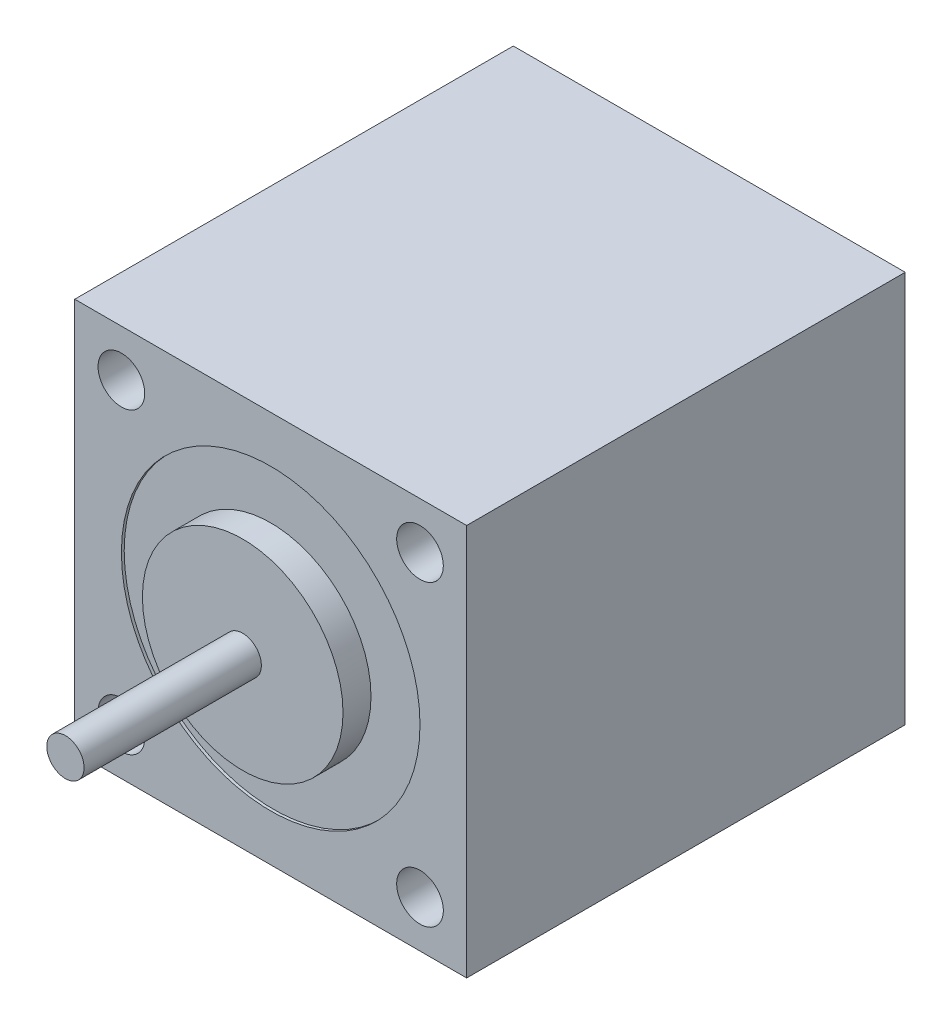
ISO-10303-21;
HEADER;
FILE_DESCRIPTION(('STEP AP214'),'2;1');
FILE_NAME('part.step','',(''),(''),'','','');
FILE_SCHEMA(('AUTOMOTIVE_DESIGN { 1 0 10303 214 1 1 1 1 }'));
ENDSEC;
DATA;
#1=APPLICATION_CONTEXT('core data for automotive mechanical design processes');
#2=APPLICATION_PROTOCOL_DEFINITION('international standard','automotive_design',2000,#1);
#3=PRODUCT_CONTEXT('',#1,'mechanical');
#4=PRODUCT('Part','Part','',(#3));
#5=PRODUCT_RELATED_PRODUCT_CATEGORY('part','',(#4));
#6=PRODUCT_DEFINITION_FORMATION('','',#4);
#7=PRODUCT_DEFINITION_CONTEXT('part definition',#1,'design');
#8=PRODUCT_DEFINITION('design','',#6,#7);
#9=PRODUCT_DEFINITION_SHAPE('','',#8);
#10=(LENGTH_UNIT() NAMED_UNIT(*) SI_UNIT(.MILLI.,.METRE.));
#11=(NAMED_UNIT(*) PLANE_ANGLE_UNIT() SI_UNIT($,.RADIAN.));
#12=(NAMED_UNIT(*) SI_UNIT($,.STERADIAN.) SOLID_ANGLE_UNIT());
#13=UNCERTAINTY_MEASURE_WITH_UNIT(LENGTH_MEASURE(1.E-05),#10,'distance_accuracy_value','');
#14=(GEOMETRIC_REPRESENTATION_CONTEXT(3) GLOBAL_UNCERTAINTY_ASSIGNED_CONTEXT((#13)) GLOBAL_UNIT_ASSIGNED_CONTEXT((#10,
#11,#12)) REPRESENTATION_CONTEXT('',''));
#15=CARTESIAN_POINT('',(0.,0.,0.));
#16=DIRECTION('',(0.,0.,1.));
#17=DIRECTION('',(1.,0.,0.));
#18=AXIS2_PLACEMENT_3D('',#15,#16,#17);
#19=CARTESIAN_POINT('',(21.,-21.,47.));
#20=DIRECTION('',(-1.,0.,0.));
#21=DIRECTION('',(0.,0.,1.));
#22=AXIS2_PLACEMENT_3D('',#19,#20,#21);
#23=PLANE('',#22);
#24=DIRECTION('',(0.,1.,0.));
#25=VECTOR('',#24,1.);
#26=CARTESIAN_POINT('',(21.,-21.,0.));
#27=LINE('',#26,#25);
#28=CARTESIAN_POINT('',(21.,-21.,0.));
#29=VERTEX_POINT('',#28);
#30=CARTESIAN_POINT('',(21.,21.,0.));
#31=VERTEX_POINT('',#30);
#32=EDGE_CURVE('E122',#29,#31,#27,.T.);
#33=ORIENTED_EDGE('',*,*,#32,.T.);
#34=DIRECTION('',(0.,0.,-1.));
#35=VECTOR('',#34,1.);
#36=CARTESIAN_POINT('',(21.,21.,47.));
#37=LINE('',#36,#35);
#38=CARTESIAN_POINT('',(21.,21.,47.));
#39=VERTEX_POINT('',#38);
#40=EDGE_CURVE('E105',#39,#31,#37,.T.);
#41=ORIENTED_EDGE('',*,*,#40,.F.);
#42=DIRECTION('',(0.,1.,0.));
#43=VECTOR('',#42,1.);
#44=CARTESIAN_POINT('',(21.,-21.,47.));
#45=LINE('',#44,#43);
#46=CARTESIAN_POINT('',(21.,-21.,47.));
#47=VERTEX_POINT('',#46);
#48=EDGE_CURVE('E133',#47,#39,#45,.T.);
#49=ORIENTED_EDGE('',*,*,#48,.F.);
#50=DIRECTION('',(0.,0.,-1.));
#51=VECTOR('',#50,1.);
#52=CARTESIAN_POINT('',(21.,-21.,47.));
#53=LINE('',#52,#51);
#54=EDGE_CURVE('E108',#47,#29,#53,.T.);
#55=ORIENTED_EDGE('',*,*,#54,.T.);
#56=EDGE_LOOP('',(#33,#41,#49,#55));
#57=FACE_BOUND('',#56,.T.);
#58=ADVANCED_FACE('F50',(#57),#23,.F.);
#59=CARTESIAN_POINT('',(-21.,21.,47.));
#60=DIRECTION('',(0.,-1.,0.));
#61=DIRECTION('',(0.,0.,-1.));
#62=AXIS2_PLACEMENT_3D('',#59,#60,#61);
#63=PLANE('',#62);
#64=DIRECTION('',(-1.,0.,0.));
#65=VECTOR('',#64,1.);
#66=CARTESIAN_POINT('',(-21.,21.,0.));
#67=LINE('',#66,#65);
#68=CARTESIAN_POINT('',(-21.,21.,0.));
#69=VERTEX_POINT('',#68);
#70=EDGE_CURVE('E68',#31,#69,#67,.T.);
#71=ORIENTED_EDGE('',*,*,#70,.T.);
#72=DIRECTION('',(0.,0.,-1.));
#73=VECTOR('',#72,1.);
#74=CARTESIAN_POINT('',(-21.,21.,47.));
#75=LINE('',#74,#73);
#76=CARTESIAN_POINT('',(-21.,21.,47.));
#77=VERTEX_POINT('',#76);
#78=EDGE_CURVE('E102',#77,#69,#75,.T.);
#79=ORIENTED_EDGE('',*,*,#78,.F.);
#80=DIRECTION('',(-1.,0.,0.));
#81=VECTOR('',#80,1.);
#82=CARTESIAN_POINT('',(-21.,21.,47.));
#83=LINE('',#82,#81);
#84=EDGE_CURVE('E84',#39,#77,#83,.T.);
#85=ORIENTED_EDGE('',*,*,#84,.F.);
#86=ORIENTED_EDGE('',*,*,#40,.T.);
#87=EDGE_LOOP('',(#71,#79,#85,#86));
#88=FACE_BOUND('',#87,.T.);
#89=ADVANCED_FACE('F101',(#88),#63,.F.);
#90=CARTESIAN_POINT('',(-21.,-21.,47.));
#91=DIRECTION('',(1.,0.,0.));
#92=DIRECTION('',(0.,0.,-1.));
#93=AXIS2_PLACEMENT_3D('',#90,#91,#92);
#94=PLANE('',#93);
#95=DIRECTION('',(0.,-1.,0.));
#96=VECTOR('',#95,1.);
#97=CARTESIAN_POINT('',(-21.,-21.,0.));
#98=LINE('',#97,#96);
#99=CARTESIAN_POINT('',(-21.,-21.,0.));
#100=VERTEX_POINT('',#99);
#101=EDGE_CURVE('E99',#69,#100,#98,.T.);
#102=ORIENTED_EDGE('',*,*,#101,.T.);
#103=DIRECTION('',(0.,0.,-1.));
#104=VECTOR('',#103,1.);
#105=CARTESIAN_POINT('',(-21.,-21.,47.));
#106=LINE('',#105,#104);
#107=CARTESIAN_POINT('',(-21.,-21.,47.));
#108=VERTEX_POINT('',#107);
#109=EDGE_CURVE('E136',#108,#100,#106,.T.);
#110=ORIENTED_EDGE('',*,*,#109,.F.);
#111=DIRECTION('',(0.,-1.,0.));
#112=VECTOR('',#111,1.);
#113=CARTESIAN_POINT('',(-21.,-21.,47.));
#114=LINE('',#113,#112);
#115=EDGE_CURVE('E111',#77,#108,#114,.T.);
#116=ORIENTED_EDGE('',*,*,#115,.F.);
#117=ORIENTED_EDGE('',*,*,#78,.T.);
#118=EDGE_LOOP('',(#102,#110,#116,#117));
#119=FACE_BOUND('',#118,.T.);
#120=ADVANCED_FACE('F110',(#119),#94,.F.);
#121=CARTESIAN_POINT('',(-21.,-21.,47.));
#122=DIRECTION('',(0.,1.,0.));
#123=DIRECTION('',(0.,0.,1.));
#124=AXIS2_PLACEMENT_3D('',#121,#122,#123);
#125=PLANE('',#124);
#126=DIRECTION('',(1.,0.,0.));
#127=VECTOR('',#126,1.);
#128=CARTESIAN_POINT('',(-21.,-21.,0.));
#129=LINE('',#128,#127);
#130=EDGE_CURVE('E93',#100,#29,#129,.T.);
#131=ORIENTED_EDGE('',*,*,#130,.T.);
#132=ORIENTED_EDGE('',*,*,#54,.F.);
#133=DIRECTION('',(1.,0.,0.));
#134=VECTOR('',#133,1.);
#135=CARTESIAN_POINT('',(-21.,-21.,47.));
#136=LINE('',#135,#134);
#137=EDGE_CURVE('E125',#108,#47,#136,.T.);
#138=ORIENTED_EDGE('',*,*,#137,.F.);
#139=ORIENTED_EDGE('',*,*,#109,.T.);
#140=EDGE_LOOP('',(#131,#132,#138,#139));
#141=FACE_BOUND('',#140,.T.);
#142=ADVANCED_FACE('F176',(#141),#125,.F.);
#143=CARTESIAN_POINT('',(0.,0.,47.));
#144=DIRECTION('',(0.,0.,-1.));
#145=DIRECTION('',(-1.,0.,0.));
#146=AXIS2_PLACEMENT_3D('',#143,#144,#145);
#147=PLANE('',#146);
#148=CARTESIAN_POINT('',(0.,0.,47.));
#149=DIRECTION('',(0.,0.,1.));
#150=DIRECTION('',(1.,0.,0.));
#151=AXIS2_PLACEMENT_3D('',#148,#149,#150);
#152=CIRCLE('',#151,16.);
#153=CARTESIAN_POINT('',(16.,0.,47.));
#154=VERTEX_POINT('',#153);
#155=EDGE_CURVE('E60',#154,#154,#152,.T.);
#156=ORIENTED_EDGE('',*,*,#155,.F.);
#157=EDGE_LOOP('',(#156));
#158=FACE_BOUND('',#157,.T.);
#159=CARTESIAN_POINT('',(-16.,-16.,47.));
#160=DIRECTION('',(0.,0.,1.));
#161=DIRECTION('',(1.,0.,0.));
#162=AXIS2_PLACEMENT_3D('',#159,#160,#161);
#163=CIRCLE('',#162,2.5);
#164=CARTESIAN_POINT('',(-13.5,-16.,47.));
#165=VERTEX_POINT('',#164);
#166=EDGE_CURVE('E151',#165,#165,#163,.T.);
#167=ORIENTED_EDGE('',*,*,#166,.F.);
#168=EDGE_LOOP('',(#167));
#169=FACE_BOUND('',#168,.T.);
#170=CARTESIAN_POINT('',(16.,-16.,47.));
#171=DIRECTION('',(0.,0.,1.));
#172=DIRECTION('',(-1.,0.,0.));
#173=AXIS2_PLACEMENT_3D('',#170,#171,#172);
#174=CIRCLE('',#173,2.5);
#175=CARTESIAN_POINT('',(13.5,-16.,47.));
#176=VERTEX_POINT('',#175);
#177=EDGE_CURVE('E155',#176,#176,#174,.T.);
#178=ORIENTED_EDGE('',*,*,#177,.F.);
#179=EDGE_LOOP('',(#178));
#180=FACE_BOUND('',#179,.T.);
#181=CARTESIAN_POINT('',(16.,16.,47.));
#182=DIRECTION('',(0.,0.,1.));
#183=DIRECTION('',(1.,0.,0.));
#184=AXIS2_PLACEMENT_3D('',#181,#182,#183);
#185=CIRCLE('',#184,2.5);
#186=CARTESIAN_POINT('',(18.5,16.,47.));
#187=VERTEX_POINT('',#186);
#188=EDGE_CURVE('E141',#187,#187,#185,.T.);
#189=ORIENTED_EDGE('',*,*,#188,.F.);
#190=EDGE_LOOP('',(#189));
#191=FACE_BOUND('',#190,.T.);
#192=CARTESIAN_POINT('',(-16.,16.,47.));
#193=DIRECTION('',(0.,0.,1.));
#194=DIRECTION('',(-1.,0.,0.));
#195=AXIS2_PLACEMENT_3D('',#192,#193,#194);
#196=CIRCLE('',#195,2.5);
#197=CARTESIAN_POINT('',(-18.5,16.,47.));
#198=VERTEX_POINT('',#197);
#199=EDGE_CURVE('E137',#198,#198,#196,.T.);
#200=ORIENTED_EDGE('',*,*,#199,.F.);
#201=EDGE_LOOP('',(#200));
#202=FACE_BOUND('',#201,.T.);
#203=ORIENTED_EDGE('',*,*,#48,.T.);
#204=ORIENTED_EDGE('',*,*,#84,.T.);
#205=ORIENTED_EDGE('',*,*,#115,.T.);
#206=ORIENTED_EDGE('',*,*,#137,.T.);
#207=EDGE_LOOP('',(#203,#204,#205,#206));
#208=FACE_BOUND('',#207,.T.);
#209=ADVANCED_FACE('F173',(#158,#169,#180,#191,#202,#208),#147,.F.);
#210=CARTESIAN_POINT('',(0.,0.,0.));
#211=DIRECTION('',(0.,0.,-1.));
#212=DIRECTION('',(-1.,0.,0.));
#213=AXIS2_PLACEMENT_3D('',#210,#211,#212);
#214=PLANE('',#213);
#215=CARTESIAN_POINT('',(-16.,-16.,0.));
#216=DIRECTION('',(0.,0.,1.));
#217=DIRECTION('',(1.,0.,0.));
#218=AXIS2_PLACEMENT_3D('',#215,#216,#217);
#219=CIRCLE('',#218,2.5);
#220=CARTESIAN_POINT('',(-13.5,-16.,0.));
#221=VERTEX_POINT('',#220);
#222=EDGE_CURVE('E128',#221,#221,#219,.T.);
#223=ORIENTED_EDGE('',*,*,#222,.T.);
#224=EDGE_LOOP('',(#223));
#225=FACE_BOUND('',#224,.T.);
#226=CARTESIAN_POINT('',(16.,-16.,0.));
#227=DIRECTION('',(0.,0.,1.));
#228=DIRECTION('',(-1.,0.,0.));
#229=AXIS2_PLACEMENT_3D('',#226,#227,#228);
#230=CIRCLE('',#229,2.5);
#231=CARTESIAN_POINT('',(13.5,-16.,0.));
#232=VERTEX_POINT('',#231);
#233=EDGE_CURVE('E150',#232,#232,#230,.T.);
#234=ORIENTED_EDGE('',*,*,#233,.T.);
#235=EDGE_LOOP('',(#234));
#236=FACE_BOUND('',#235,.T.);
#237=CARTESIAN_POINT('',(16.,16.,0.));
#238=DIRECTION('',(0.,0.,1.));
#239=DIRECTION('',(1.,0.,0.));
#240=AXIS2_PLACEMENT_3D('',#237,#238,#239);
#241=CIRCLE('',#240,2.5);
#242=CARTESIAN_POINT('',(18.5,16.,0.));
#243=VERTEX_POINT('',#242);
#244=EDGE_CURVE('E146',#243,#243,#241,.T.);
#245=ORIENTED_EDGE('',*,*,#244,.T.);
#246=EDGE_LOOP('',(#245));
#247=FACE_BOUND('',#246,.T.);
#248=CARTESIAN_POINT('',(-16.,16.,0.));
#249=DIRECTION('',(0.,0.,1.));
#250=DIRECTION('',(-1.,0.,0.));
#251=AXIS2_PLACEMENT_3D('',#248,#249,#250);
#252=CIRCLE('',#251,2.5);
#253=CARTESIAN_POINT('',(-18.5,16.,0.));
#254=VERTEX_POINT('',#253);
#255=EDGE_CURVE('E142',#254,#254,#252,.T.);
#256=ORIENTED_EDGE('',*,*,#255,.T.);
#257=EDGE_LOOP('',(#256));
#258=FACE_BOUND('',#257,.T.);
#259=ORIENTED_EDGE('',*,*,#32,.F.);
#260=ORIENTED_EDGE('',*,*,#130,.F.);
#261=ORIENTED_EDGE('',*,*,#101,.F.);
#262=ORIENTED_EDGE('',*,*,#70,.F.);
#263=EDGE_LOOP('',(#259,#260,#261,#262));
#264=FACE_BOUND('',#263,.T.);
#265=ADVANCED_FACE('F114',(#225,#236,#247,#258,#264),#214,.T.);
#266=CARTESIAN_POINT('',(-16.,16.,0.));
#267=DIRECTION('',(0.,0.,1.));
#268=DIRECTION('',(1.,0.,0.));
#269=AXIS2_PLACEMENT_3D('',#266,#267,#268);
#270=CYLINDRICAL_SURFACE('',#269,2.5);
#271=ORIENTED_EDGE('',*,*,#255,.F.);
#272=EDGE_LOOP('',(#271));
#273=FACE_BOUND('',#272,.T.);
#274=ORIENTED_EDGE('',*,*,#199,.T.);
#275=EDGE_LOOP('',(#274));
#276=FACE_BOUND('',#275,.T.);
#277=ADVANCED_FACE('F233',(#273,#276),#270,.F.);
#278=CARTESIAN_POINT('',(16.,16.,0.));
#279=DIRECTION('',(0.,0.,1.));
#280=DIRECTION('',(1.,0.,0.));
#281=AXIS2_PLACEMENT_3D('',#278,#279,#280);
#282=CYLINDRICAL_SURFACE('',#281,2.5);
#283=ORIENTED_EDGE('',*,*,#244,.F.);
#284=EDGE_LOOP('',(#283));
#285=FACE_BOUND('',#284,.T.);
#286=ORIENTED_EDGE('',*,*,#188,.T.);
#287=EDGE_LOOP('',(#286));
#288=FACE_BOUND('',#287,.T.);
#289=ADVANCED_FACE('F243',(#285,#288),#282,.F.);
#290=CARTESIAN_POINT('',(16.,-16.,0.));
#291=DIRECTION('',(0.,0.,1.));
#292=DIRECTION('',(1.,0.,0.));
#293=AXIS2_PLACEMENT_3D('',#290,#291,#292);
#294=CYLINDRICAL_SURFACE('',#293,2.5);
#295=ORIENTED_EDGE('',*,*,#233,.F.);
#296=EDGE_LOOP('',(#295));
#297=FACE_BOUND('',#296,.T.);
#298=ORIENTED_EDGE('',*,*,#177,.T.);
#299=EDGE_LOOP('',(#298));
#300=FACE_BOUND('',#299,.T.);
#301=ADVANCED_FACE('F254',(#297,#300),#294,.F.);
#302=CARTESIAN_POINT('',(-16.,-16.,0.));
#303=DIRECTION('',(0.,0.,1.));
#304=DIRECTION('',(1.,0.,0.));
#305=AXIS2_PLACEMENT_3D('',#302,#303,#304);
#306=CYLINDRICAL_SURFACE('',#305,2.5);
#307=ORIENTED_EDGE('',*,*,#222,.F.);
#308=EDGE_LOOP('',(#307));
#309=FACE_BOUND('',#308,.T.);
#310=ORIENTED_EDGE('',*,*,#166,.T.);
#311=EDGE_LOOP('',(#310));
#312=FACE_BOUND('',#311,.T.);
#313=ADVANCED_FACE('F265',(#309,#312),#306,.F.);
#314=CARTESIAN_POINT('',(0.,0.,46.7));
#315=DIRECTION('',(0.,0.,1.));
#316=DIRECTION('',(1.,0.,0.));
#317=AXIS2_PLACEMENT_3D('',#314,#315,#316);
#318=CYLINDRICAL_SURFACE('',#317,16.);
#319=CARTESIAN_POINT('',(0.,0.,46.7));
#320=DIRECTION('',(0.,0.,1.));
#321=DIRECTION('',(1.,0.,0.));
#322=AXIS2_PLACEMENT_3D('',#319,#320,#321);
#323=CIRCLE('',#322,16.);
#324=CARTESIAN_POINT('',(16.,0.,46.7));
#325=VERTEX_POINT('',#324);
#326=EDGE_CURVE('E12',#325,#325,#323,.T.);
#327=ORIENTED_EDGE('',*,*,#326,.F.);
#328=EDGE_LOOP('',(#327));
#329=FACE_BOUND('',#328,.T.);
#330=ORIENTED_EDGE('',*,*,#155,.T.);
#331=EDGE_LOOP('',(#330));
#332=FACE_BOUND('',#331,.T.);
#333=ADVANCED_FACE('F171',(#329,#332),#318,.F.);
#334=CARTESIAN_POINT('',(0.,0.,46.7));
#335=DIRECTION('',(0.,0.,1.));
#336=DIRECTION('',(1.,0.,0.));
#337=AXIS2_PLACEMENT_3D('',#334,#335,#336);
#338=PLANE('',#337);
#339=ORIENTED_EDGE('',*,*,#326,.T.);
#340=EDGE_LOOP('',(#339));
#341=FACE_BOUND('',#340,.T.);
#342=ADVANCED_FACE('F52',(#341),#338,.T.);
#343=CLOSED_SHELL('',(#58,#89,#120,#142,#209,#265,#277,#289,#301,#313,#333,#342));
#344=MANIFOLD_SOLID_BREP('B2',#343);
#345=CARTESIAN_POINT('',(0.,0.,50.));
#346=DIRECTION('',(0.,0.,1.));
#347=DIRECTION('',(1.,0.,0.));
#348=AXIS2_PLACEMENT_3D('',#345,#346,#347);
#349=PLANE('',#348);
#350=CARTESIAN_POINT('',(0.,0.,50.));
#351=DIRECTION('',(0.,0.,1.));
#352=DIRECTION('',(1.,0.,0.));
#353=AXIS2_PLACEMENT_3D('',#350,#351,#352);
#354=CIRCLE('',#353,2.);
#355=CARTESIAN_POINT('',(2.,0.,50.));
#356=VERTEX_POINT('',#355);
#357=EDGE_CURVE('E49',#356,#356,#354,.T.);
#358=ORIENTED_EDGE('',*,*,#357,.F.);
#359=EDGE_LOOP('',(#358));
#360=FACE_BOUND('',#359,.T.);
#361=CARTESIAN_POINT('',(0.,0.,50.));
#362=DIRECTION('',(0.,0.,1.));
#363=DIRECTION('',(1.,0.,0.));
#364=AXIS2_PLACEMENT_3D('',#361,#362,#363);
#365=CIRCLE('',#364,10.75);
#366=CARTESIAN_POINT('',(10.75,0.,50.));
#367=VERTEX_POINT('',#366);
#368=EDGE_CURVE('E338',#367,#367,#365,.T.);
#369=ORIENTED_EDGE('',*,*,#368,.T.);
#370=EDGE_LOOP('',(#369));
#371=FACE_BOUND('',#370,.T.);
#372=ADVANCED_FACE('F334',(#360,#371),#349,.T.);
#373=CARTESIAN_POINT('',(0.,0.,50.));
#374=DIRECTION('',(0.,0.,-1.));
#375=DIRECTION('',(-1.,0.,0.));
#376=AXIS2_PLACEMENT_3D('',#373,#374,#375);
#377=CYLINDRICAL_SURFACE('',#376,10.75);
#378=ORIENTED_EDGE('',*,*,#368,.F.);
#379=EDGE_LOOP('',(#378));
#380=FACE_BOUND('',#379,.T.);
#381=CARTESIAN_POINT('',(0.,0.,47.));
#382=DIRECTION('',(0.,0.,1.));
#383=DIRECTION('',(1.,0.,0.));
#384=AXIS2_PLACEMENT_3D('',#381,#382,#383);
#385=CIRCLE('',#384,10.75);
#386=CARTESIAN_POINT('',(10.75,0.,47.));
#387=VERTEX_POINT('',#386);
#388=EDGE_CURVE('E346',#387,#387,#385,.T.);
#389=ORIENTED_EDGE('',*,*,#388,.T.);
#390=EDGE_LOOP('',(#389));
#391=FACE_BOUND('',#390,.T.);
#392=ADVANCED_FACE('F336',(#380,#391),#377,.T.);
#393=CARTESIAN_POINT('',(0.,0.,47.));
#394=DIRECTION('',(0.,0.,1.));
#395=DIRECTION('',(1.,0.,0.));
#396=AXIS2_PLACEMENT_3D('',#393,#394,#395);
#397=PLANE('',#396);
#398=ORIENTED_EDGE('',*,*,#388,.F.);
#399=EDGE_LOOP('',(#398));
#400=FACE_BOUND('',#399,.T.);
#401=ADVANCED_FACE('F359',(#400),#397,.F.);
#402=CARTESIAN_POINT('',(0.,0.,69.));
#403=DIRECTION('',(0.,0.,-1.));
#404=DIRECTION('',(-1.,0.,0.));
#405=AXIS2_PLACEMENT_3D('',#402,#403,#404);
#406=CYLINDRICAL_SURFACE('',#405,2.);
#407=CARTESIAN_POINT('',(0.,0.,69.));
#408=DIRECTION('',(0.,0.,1.));
#409=DIRECTION('',(1.,0.,0.));
#410=AXIS2_PLACEMENT_3D('',#407,#408,#409);
#411=CIRCLE('',#410,2.);
#412=CARTESIAN_POINT('',(2.,0.,69.));
#413=VERTEX_POINT('',#412);
#414=EDGE_CURVE('E348',#413,#413,#411,.T.);
#415=ORIENTED_EDGE('',*,*,#414,.F.);
#416=EDGE_LOOP('',(#415));
#417=FACE_BOUND('',#416,.T.);
#418=ORIENTED_EDGE('',*,*,#357,.T.);
#419=EDGE_LOOP('',(#418));
#420=FACE_BOUND('',#419,.T.);
#421=ADVANCED_FACE('F357',(#417,#420),#406,.T.);
#422=CARTESIAN_POINT('',(0.,0.,69.));
#423=DIRECTION('',(0.,0.,1.));
#424=DIRECTION('',(1.,0.,0.));
#425=AXIS2_PLACEMENT_3D('',#422,#423,#424);
#426=PLANE('',#425);
#427=ORIENTED_EDGE('',*,*,#414,.T.);
#428=EDGE_LOOP('',(#427));
#429=FACE_BOUND('',#428,.T.);
#430=ADVANCED_FACE('F355',(#429),#426,.T.);
#431=CLOSED_SHELL('',(#372,#392,#401,#421,#430));
#432=MANIFOLD_SOLID_BREP('B6',#431);
#433=ADVANCED_BREP_SHAPE_REPRESENTATION('',(#18,#344,#432),#14);
#434=SHAPE_DEFINITION_REPRESENTATION(#9,#433);
ENDSEC;
END-ISO-10303-21;
